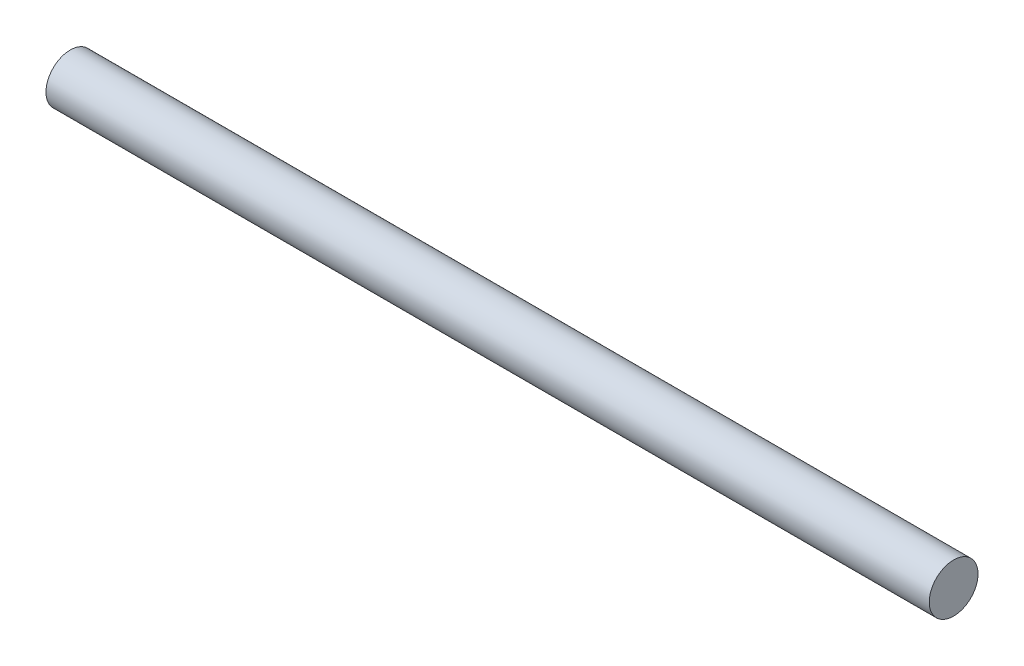
ISO-10303-21;
HEADER;
FILE_DESCRIPTION(('STEP AP214'),'2;1');
FILE_NAME('part.step','',(''),(''),'','','');
FILE_SCHEMA(('AUTOMOTIVE_DESIGN { 1 0 10303 214 1 1 1 1 }'));
ENDSEC;
DATA;
#1=APPLICATION_CONTEXT('core data for automotive mechanical design processes');
#2=APPLICATION_PROTOCOL_DEFINITION('international standard','automotive_design',2000,#1);
#3=PRODUCT_CONTEXT('',#1,'mechanical');
#4=PRODUCT('Part','Part','',(#3));
#5=PRODUCT_RELATED_PRODUCT_CATEGORY('part','',(#4));
#6=PRODUCT_DEFINITION_FORMATION('','',#4);
#7=PRODUCT_DEFINITION_CONTEXT('part definition',#1,'design');
#8=PRODUCT_DEFINITION('design','',#6,#7);
#9=PRODUCT_DEFINITION_SHAPE('','',#8);
#10=(LENGTH_UNIT() NAMED_UNIT(*) SI_UNIT(.MILLI.,.METRE.));
#11=(NAMED_UNIT(*) PLANE_ANGLE_UNIT() SI_UNIT($,.RADIAN.));
#12=(NAMED_UNIT(*) SI_UNIT($,.STERADIAN.) SOLID_ANGLE_UNIT());
#13=UNCERTAINTY_MEASURE_WITH_UNIT(LENGTH_MEASURE(1.E-05),#10,'distance_accuracy_value','');
#14=(GEOMETRIC_REPRESENTATION_CONTEXT(3) GLOBAL_UNCERTAINTY_ASSIGNED_CONTEXT((#13)) GLOBAL_UNIT_ASSIGNED_CONTEXT((#10,
#11,#12)) REPRESENTATION_CONTEXT('',''));
#15=CARTESIAN_POINT('',(0.,0.,0.));
#16=DIRECTION('',(0.,0.,1.));
#17=DIRECTION('',(1.,0.,0.));
#18=AXIS2_PLACEMENT_3D('',#15,#16,#17);
#19=CARTESIAN_POINT('',(145.,0.,0.));
#20=DIRECTION('',(-1.,0.,0.));
#21=DIRECTION('',(0.,0.,1.));
#22=AXIS2_PLACEMENT_3D('',#19,#20,#21);
#23=CYLINDRICAL_SURFACE('',#22,4.);
#24=CARTESIAN_POINT('',(145.,0.,0.));
#25=DIRECTION('',(1.,0.,0.));
#26=DIRECTION('',(0.,0.,-1.));
#27=AXIS2_PLACEMENT_3D('',#24,#25,#26);
#28=CIRCLE('',#27,4.);
#29=CARTESIAN_POINT('',(145.,0.,-4.));
#30=VERTEX_POINT('',#29);
#31=EDGE_CURVE('E10',#30,#30,#28,.T.);
#32=ORIENTED_EDGE('',*,*,#31,.F.);
#33=EDGE_LOOP('',(#32));
#34=FACE_BOUND('',#33,.T.);
#35=CARTESIAN_POINT('',(0.,0.,0.));
#36=DIRECTION('',(1.,0.,0.));
#37=DIRECTION('',(0.,0.,-1.));
#38=AXIS2_PLACEMENT_3D('',#35,#36,#37);
#39=CIRCLE('',#38,4.);
#40=CARTESIAN_POINT('',(0.,0.,-4.));
#41=VERTEX_POINT('',#40);
#42=EDGE_CURVE('E40',#41,#41,#39,.T.);
#43=ORIENTED_EDGE('',*,*,#42,.T.);
#44=EDGE_LOOP('',(#43));
#45=FACE_BOUND('',#44,.T.);
#46=ADVANCED_FACE('F37',(#34,#45),#23,.T.);
#47=CARTESIAN_POINT('',(145.,0.,0.));
#48=DIRECTION('',(1.,0.,0.));
#49=DIRECTION('',(0.,0.,-1.));
#50=AXIS2_PLACEMENT_3D('',#47,#48,#49);
#51=PLANE('',#50);
#52=ORIENTED_EDGE('',*,*,#31,.T.);
#53=EDGE_LOOP('',(#52));
#54=FACE_BOUND('',#53,.T.);
#55=ADVANCED_FACE('F52',(#54),#51,.T.);
#56=CARTESIAN_POINT('',(0.,0.,0.));
#57=DIRECTION('',(1.,0.,0.));
#58=DIRECTION('',(0.,0.,-1.));
#59=AXIS2_PLACEMENT_3D('',#56,#57,#58);
#60=PLANE('',#59);
#61=ORIENTED_EDGE('',*,*,#42,.F.);
#62=EDGE_LOOP('',(#61));
#63=FACE_BOUND('',#62,.T.);
#64=ADVANCED_FACE('F50',(#63),#60,.F.);
#65=CLOSED_SHELL('',(#46,#55,#64));
#66=MANIFOLD_SOLID_BREP('B2',#65);
#67=ADVANCED_BREP_SHAPE_REPRESENTATION('',(#18,#66),#14);
#68=SHAPE_DEFINITION_REPRESENTATION(#9,#67);
ENDSEC;
END-ISO-10303-21;
